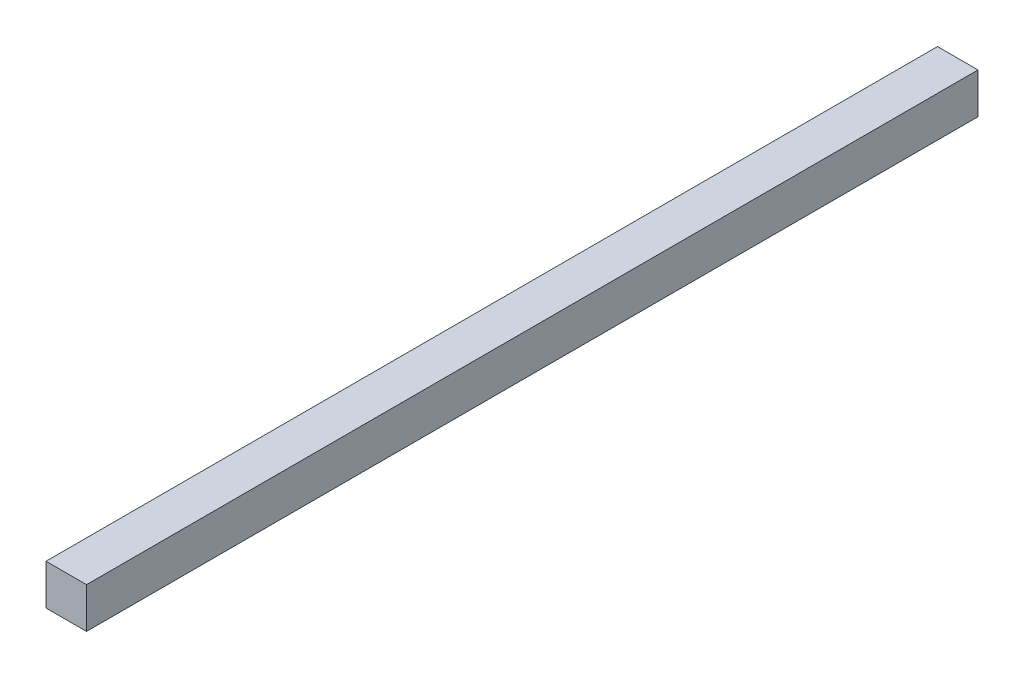
ISO-10303-21;
HEADER;
FILE_DESCRIPTION(('STEP AP214'),'2;1');
FILE_NAME('part.step','',(''),(''),'','','');
FILE_SCHEMA(('AUTOMOTIVE_DESIGN { 1 0 10303 214 1 1 1 1 }'));
ENDSEC;
DATA;
#1=APPLICATION_CONTEXT('core data for automotive mechanical design processes');
#2=APPLICATION_PROTOCOL_DEFINITION('international standard','automotive_design',2000,#1);
#3=PRODUCT_CONTEXT('',#1,'mechanical');
#4=PRODUCT('Part','Part','',(#3));
#5=PRODUCT_RELATED_PRODUCT_CATEGORY('part','',(#4));
#6=PRODUCT_DEFINITION_FORMATION('','',#4);
#7=PRODUCT_DEFINITION_CONTEXT('part definition',#1,'design');
#8=PRODUCT_DEFINITION('design','',#6,#7);
#9=PRODUCT_DEFINITION_SHAPE('','',#8);
#10=(LENGTH_UNIT() NAMED_UNIT(*) SI_UNIT(.MILLI.,.METRE.));
#11=(NAMED_UNIT(*) PLANE_ANGLE_UNIT() SI_UNIT($,.RADIAN.));
#12=(NAMED_UNIT(*) SI_UNIT($,.STERADIAN.) SOLID_ANGLE_UNIT());
#13=UNCERTAINTY_MEASURE_WITH_UNIT(LENGTH_MEASURE(1.E-05),#10,'distance_accuracy_value','');
#14=(GEOMETRIC_REPRESENTATION_CONTEXT(3) GLOBAL_UNCERTAINTY_ASSIGNED_CONTEXT((#13)) GLOBAL_UNIT_ASSIGNED_CONTEXT((#10,
#11,#12)) REPRESENTATION_CONTEXT('',''));
#15=CARTESIAN_POINT('',(0.,0.,0.));
#16=DIRECTION('',(0.,0.,1.));
#17=DIRECTION('',(1.,0.,0.));
#18=AXIS2_PLACEMENT_3D('',#15,#16,#17);
#19=CARTESIAN_POINT('',(330.,1300.,-500.));
#20=DIRECTION('',(-1.,0.,0.));
#21=DIRECTION('',(0.,0.,1.));
#22=AXIS2_PLACEMENT_3D('',#19,#20,#21);
#23=PLANE('',#22);
#24=DIRECTION('',(0.,-1.,0.));
#25=VECTOR('',#24,1.);
#26=CARTESIAN_POINT('',(330.,1300.,-60.));
#27=LINE('',#26,#25);
#28=CARTESIAN_POINT('',(330.,1320.,-60.));
#29=VERTEX_POINT('',#28);
#30=CARTESIAN_POINT('',(330.,1300.,-60.));
#31=VERTEX_POINT('',#30);
#32=EDGE_CURVE('E103',#29,#31,#27,.T.);
#33=ORIENTED_EDGE('',*,*,#32,.F.);
#34=DIRECTION('',(0.,0.,1.));
#35=VECTOR('',#34,1.);
#36=CARTESIAN_POINT('',(330.,1320.,-500.));
#37=LINE('',#36,#35);
#38=CARTESIAN_POINT('',(330.,1320.,-500.));
#39=VERTEX_POINT('',#38);
#40=EDGE_CURVE('E11',#39,#29,#37,.T.);
#41=ORIENTED_EDGE('',*,*,#40,.F.);
#42=DIRECTION('',(0.,-1.,0.));
#43=VECTOR('',#42,1.);
#44=CARTESIAN_POINT('',(330.,1300.,-500.));
#45=LINE('',#44,#43);
#46=CARTESIAN_POINT('',(330.,1300.,-500.));
#47=VERTEX_POINT('',#46);
#48=EDGE_CURVE('E97',#39,#47,#45,.T.);
#49=ORIENTED_EDGE('',*,*,#48,.T.);
#50=DIRECTION('',(0.,0.,1.));
#51=VECTOR('',#50,1.);
#52=CARTESIAN_POINT('',(330.,1300.,-500.));
#53=LINE('',#52,#51);
#54=EDGE_CURVE('E42',#47,#31,#53,.T.);
#55=ORIENTED_EDGE('',*,*,#54,.T.);
#56=EDGE_LOOP('',(#33,#41,#49,#55));
#57=FACE_BOUND('',#56,.T.);
#58=ADVANCED_FACE('F39',(#57),#23,.T.);
#59=CARTESIAN_POINT('',(330.,1320.,-500.));
#60=DIRECTION('',(0.,1.,0.));
#61=DIRECTION('',(0.,0.,1.));
#62=AXIS2_PLACEMENT_3D('',#59,#60,#61);
#63=PLANE('',#62);
#64=DIRECTION('',(-1.,0.,0.));
#65=VECTOR('',#64,1.);
#66=CARTESIAN_POINT('',(330.,1320.,-60.));
#67=LINE('',#66,#65);
#68=CARTESIAN_POINT('',(350.,1320.,-60.));
#69=VERTEX_POINT('',#68);
#70=EDGE_CURVE('E99',#69,#29,#67,.T.);
#71=ORIENTED_EDGE('',*,*,#70,.F.);
#72=DIRECTION('',(0.,0.,1.));
#73=VECTOR('',#72,1.);
#74=CARTESIAN_POINT('',(350.,1320.,-500.));
#75=LINE('',#74,#73);
#76=CARTESIAN_POINT('',(350.,1320.,-500.));
#77=VERTEX_POINT('',#76);
#78=EDGE_CURVE('E48',#77,#69,#75,.T.);
#79=ORIENTED_EDGE('',*,*,#78,.F.);
#80=DIRECTION('',(-1.,0.,0.));
#81=VECTOR('',#80,1.);
#82=CARTESIAN_POINT('',(330.,1320.,-500.));
#83=LINE('',#82,#81);
#84=EDGE_CURVE('E94',#77,#39,#83,.T.);
#85=ORIENTED_EDGE('',*,*,#84,.T.);
#86=ORIENTED_EDGE('',*,*,#40,.T.);
#87=EDGE_LOOP('',(#71,#79,#85,#86));
#88=FACE_BOUND('',#87,.T.);
#89=ADVANCED_FACE('F113',(#88),#63,.T.);
#90=CARTESIAN_POINT('',(350.,1300.,-500.));
#91=DIRECTION('',(1.,0.,0.));
#92=DIRECTION('',(0.,0.,-1.));
#93=AXIS2_PLACEMENT_3D('',#90,#91,#92);
#94=PLANE('',#93);
#95=DIRECTION('',(0.,1.,0.));
#96=VECTOR('',#95,1.);
#97=CARTESIAN_POINT('',(350.,1300.,-60.));
#98=LINE('',#97,#96);
#99=CARTESIAN_POINT('',(350.,1300.,-60.));
#100=VERTEX_POINT('',#99);
#101=EDGE_CURVE('E89',#100,#69,#98,.T.);
#102=ORIENTED_EDGE('',*,*,#101,.F.);
#103=DIRECTION('',(0.,0.,1.));
#104=VECTOR('',#103,1.);
#105=CARTESIAN_POINT('',(350.,1300.,-500.));
#106=LINE('',#105,#104);
#107=CARTESIAN_POINT('',(350.,1300.,-500.));
#108=VERTEX_POINT('',#107);
#109=EDGE_CURVE('E84',#108,#100,#106,.T.);
#110=ORIENTED_EDGE('',*,*,#109,.F.);
#111=DIRECTION('',(0.,1.,0.));
#112=VECTOR('',#111,1.);
#113=CARTESIAN_POINT('',(350.,1300.,-500.));
#114=LINE('',#113,#112);
#115=EDGE_CURVE('E87',#108,#77,#114,.T.);
#116=ORIENTED_EDGE('',*,*,#115,.T.);
#117=ORIENTED_EDGE('',*,*,#78,.T.);
#118=EDGE_LOOP('',(#102,#110,#116,#117));
#119=FACE_BOUND('',#118,.T.);
#120=ADVANCED_FACE('F86',(#119),#94,.T.);
#121=CARTESIAN_POINT('',(330.,1300.,-500.));
#122=DIRECTION('',(0.,-1.,0.));
#123=DIRECTION('',(0.,0.,-1.));
#124=AXIS2_PLACEMENT_3D('',#121,#122,#123);
#125=PLANE('',#124);
#126=DIRECTION('',(1.,0.,0.));
#127=VECTOR('',#126,1.);
#128=CARTESIAN_POINT('',(330.,1300.,-60.));
#129=LINE('',#128,#127);
#130=EDGE_CURVE('E106',#31,#100,#129,.T.);
#131=ORIENTED_EDGE('',*,*,#130,.F.);
#132=ORIENTED_EDGE('',*,*,#54,.F.);
#133=DIRECTION('',(1.,0.,0.));
#134=VECTOR('',#133,1.);
#135=CARTESIAN_POINT('',(330.,1300.,-500.));
#136=LINE('',#135,#134);
#137=EDGE_CURVE('E93',#47,#108,#136,.T.);
#138=ORIENTED_EDGE('',*,*,#137,.T.);
#139=ORIENTED_EDGE('',*,*,#109,.T.);
#140=EDGE_LOOP('',(#131,#132,#138,#139));
#141=FACE_BOUND('',#140,.T.);
#142=ADVANCED_FACE('F96',(#141),#125,.T.);
#143=CARTESIAN_POINT('',(0.,0.,-500.));
#144=DIRECTION('',(0.,0.,-1.));
#145=DIRECTION('',(-1.,0.,0.));
#146=AXIS2_PLACEMENT_3D('',#143,#144,#145);
#147=PLANE('',#146);
#148=ORIENTED_EDGE('',*,*,#48,.F.);
#149=ORIENTED_EDGE('',*,*,#84,.F.);
#150=ORIENTED_EDGE('',*,*,#115,.F.);
#151=ORIENTED_EDGE('',*,*,#137,.F.);
#152=EDGE_LOOP('',(#148,#149,#150,#151));
#153=FACE_BOUND('',#152,.T.);
#154=ADVANCED_FACE('F92',(#153),#147,.T.);
#155=CARTESIAN_POINT('',(0.,0.,-60.));
#156=DIRECTION('',(0.,0.,-1.));
#157=DIRECTION('',(-1.,0.,0.));
#158=AXIS2_PLACEMENT_3D('',#155,#156,#157);
#159=PLANE('',#158);
#160=ORIENTED_EDGE('',*,*,#32,.T.);
#161=ORIENTED_EDGE('',*,*,#130,.T.);
#162=ORIENTED_EDGE('',*,*,#101,.T.);
#163=ORIENTED_EDGE('',*,*,#70,.T.);
#164=EDGE_LOOP('',(#160,#161,#162,#163));
#165=FACE_BOUND('',#164,.T.);
#166=ADVANCED_FACE('F112',(#165),#159,.F.);
#167=CLOSED_SHELL('',(#58,#89,#120,#142,#154,#166));
#168=MANIFOLD_SOLID_BREP('B2',#167);
#169=ADVANCED_BREP_SHAPE_REPRESENTATION('',(#18,#168),#14);
#170=SHAPE_DEFINITION_REPRESENTATION(#9,#169);
ENDSEC;
END-ISO-10303-21;
